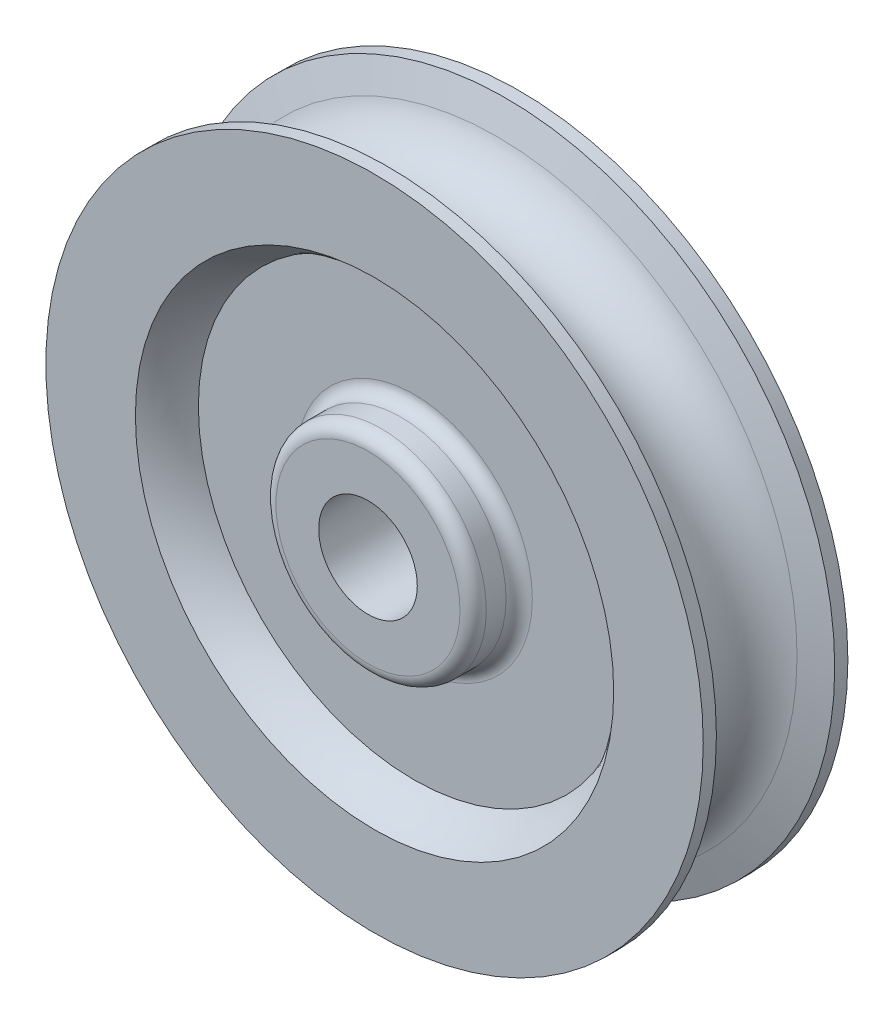
ISO-10303-21;
HEADER;
FILE_DESCRIPTION(('STEP AP214'),'2;1');
FILE_NAME('part.step','',(''),(''),'','','');
FILE_SCHEMA(('AUTOMOTIVE_DESIGN { 1 0 10303 214 1 1 1 1 }'));
ENDSEC;
DATA;
#1=APPLICATION_CONTEXT('core data for automotive mechanical design processes');
#2=APPLICATION_PROTOCOL_DEFINITION('international standard','automotive_design',2000,#1);
#3=PRODUCT_CONTEXT('',#1,'mechanical');
#4=PRODUCT('Part','Part','',(#3));
#5=PRODUCT_RELATED_PRODUCT_CATEGORY('part','',(#4));
#6=PRODUCT_DEFINITION_FORMATION('','',#4);
#7=PRODUCT_DEFINITION_CONTEXT('part definition',#1,'design');
#8=PRODUCT_DEFINITION('design','',#6,#7);
#9=PRODUCT_DEFINITION_SHAPE('','',#8);
#10=(LENGTH_UNIT() NAMED_UNIT(*) SI_UNIT(.MILLI.,.METRE.));
#11=(NAMED_UNIT(*) PLANE_ANGLE_UNIT() SI_UNIT($,.RADIAN.));
#12=(NAMED_UNIT(*) SI_UNIT($,.STERADIAN.) SOLID_ANGLE_UNIT());
#13=UNCERTAINTY_MEASURE_WITH_UNIT(LENGTH_MEASURE(1.E-05),#10,'distance_accuracy_value','');
#14=(GEOMETRIC_REPRESENTATION_CONTEXT(3) GLOBAL_UNCERTAINTY_ASSIGNED_CONTEXT((#13)) GLOBAL_UNIT_ASSIGNED_CONTEXT((#10,
#11,#12)) REPRESENTATION_CONTEXT('',''));
#15=CARTESIAN_POINT('',(0.,0.,0.));
#16=DIRECTION('',(0.,0.,1.));
#17=DIRECTION('',(1.,0.,0.));
#18=AXIS2_PLACEMENT_3D('',#15,#16,#17);
#19=CARTESIAN_POINT('',(0.,0.,-12.));
#20=DIRECTION('',(0.,0.,1.));
#21=DIRECTION('',(1.,0.,0.));
#22=AXIS2_PLACEMENT_3D('',#19,#20,#21);
#23=TOROIDAL_SURFACE('',#22,48.,16.);
#24=CARTESIAN_POINT('',(0.,0.,-23.));
#25=DIRECTION('',(0.,0.,1.));
#26=DIRECTION('',(1.,0.,0.));
#27=AXIS2_PLACEMENT_3D('',#24,#25,#26);
#28=CIRCLE('',#27,36.3810499613777);
#29=CARTESIAN_POINT('',(36.3810499613777,0.,-23.));
#30=VERTEX_POINT('',#29);
#31=EDGE_CURVE('E97',#30,#30,#28,.T.);
#32=ORIENTED_EDGE('',*,*,#31,.F.);
#33=EDGE_LOOP('',(#32));
#34=FACE_BOUND('',#33,.T.);
#35=CARTESIAN_POINT('',(0.,0.,-17.));
#36=DIRECTION('',(0.,0.,1.));
#37=DIRECTION('',(1.,0.,0.));
#38=AXIS2_PLACEMENT_3D('',#35,#36,#37);
#39=CIRCLE('',#38,32.8013158464293);
#40=CARTESIAN_POINT('',(32.8013158464293,0.,-17.));
#41=VERTEX_POINT('',#40);
#42=EDGE_CURVE('E10',#41,#41,#39,.T.);
#43=ORIENTED_EDGE('',*,*,#42,.T.);
#44=EDGE_LOOP('',(#43));
#45=FACE_BOUND('',#44,.T.);
#46=ADVANCED_FACE('F33',(#34,#45),#23,.T.);
#47=CARTESIAN_POINT('',(0.,0.,-17.));
#48=DIRECTION('',(0.,0.,1.));
#49=DIRECTION('',(1.,0.,0.));
#50=AXIS2_PLACEMENT_3D('',#47,#48,#49);
#51=PLANE('',#50);
#52=ORIENTED_EDGE('',*,*,#42,.F.);
#53=EDGE_LOOP('',(#52));
#54=FACE_BOUND('',#53,.T.);
#55=CARTESIAN_POINT('',(0.,0.,-17.));
#56=DIRECTION('',(0.,0.,1.));
#57=DIRECTION('',(1.,0.,0.));
#58=AXIS2_PLACEMENT_3D('',#55,#56,#57);
#59=CIRCLE('',#58,18.);
#60=CARTESIAN_POINT('',(18.,0.,-17.));
#61=VERTEX_POINT('',#60);
#62=EDGE_CURVE('E39',#61,#61,#59,.T.);
#63=ORIENTED_EDGE('',*,*,#62,.T.);
#64=EDGE_LOOP('',(#63));
#65=FACE_BOUND('',#64,.T.);
#66=ADVANCED_FACE('F105',(#54,#65),#51,.F.);
#67=CARTESIAN_POINT('',(0.,0.,-19.));
#68=DIRECTION('',(0.,0.,1.));
#69=DIRECTION('',(1.,0.,0.));
#70=AXIS2_PLACEMENT_3D('',#67,#68,#69);
#71=TOROIDAL_SURFACE('',#70,18.,2.);
#72=ORIENTED_EDGE('',*,*,#62,.F.);
#73=EDGE_LOOP('',(#72));
#74=FACE_BOUND('',#73,.T.);
#75=CARTESIAN_POINT('',(0.,0.,-19.));
#76=DIRECTION('',(0.,0.,1.));
#77=DIRECTION('',(1.,0.,0.));
#78=AXIS2_PLACEMENT_3D('',#75,#76,#77);
#79=CIRCLE('',#78,16.);
#80=CARTESIAN_POINT('',(16.,0.,-19.));
#81=VERTEX_POINT('',#80);
#82=EDGE_CURVE('E43',#81,#81,#79,.T.);
#83=ORIENTED_EDGE('',*,*,#82,.T.);
#84=EDGE_LOOP('',(#83));
#85=FACE_BOUND('',#84,.T.);
#86=ADVANCED_FACE('F109',(#74,#85),#71,.F.);
#87=CARTESIAN_POINT('',(0.,0.,0.));
#88=DIRECTION('',(0.,0.,1.));
#89=DIRECTION('',(1.,0.,0.));
#90=AXIS2_PLACEMENT_3D('',#87,#88,#89);
#91=CYLINDRICAL_SURFACE('',#90,16.);
#92=ORIENTED_EDGE('',*,*,#82,.F.);
#93=EDGE_LOOP('',(#92));
#94=FACE_BOUND('',#93,.T.);
#95=CARTESIAN_POINT('',(0.,0.,-22.));
#96=DIRECTION('',(0.,0.,1.));
#97=DIRECTION('',(1.,0.,0.));
#98=AXIS2_PLACEMENT_3D('',#95,#96,#97);
#99=CIRCLE('',#98,16.);
#100=CARTESIAN_POINT('',(16.,0.,-22.));
#101=VERTEX_POINT('',#100);
#102=EDGE_CURVE('E47',#101,#101,#99,.T.);
#103=ORIENTED_EDGE('',*,*,#102,.T.);
#104=EDGE_LOOP('',(#103));
#105=FACE_BOUND('',#104,.T.);
#106=ADVANCED_FACE('F114',(#94,#105),#91,.T.);
#107=CARTESIAN_POINT('',(0.,0.,-22.));
#108=DIRECTION('',(0.,0.,1.));
#109=DIRECTION('',(1.,0.,0.));
#110=AXIS2_PLACEMENT_3D('',#107,#108,#109);
#111=TOROIDAL_SURFACE('',#110,14.,2.);
#112=ORIENTED_EDGE('',*,*,#102,.F.);
#113=EDGE_LOOP('',(#112));
#114=FACE_BOUND('',#113,.T.);
#115=CARTESIAN_POINT('',(0.,0.,-24.));
#116=DIRECTION('',(0.,0.,1.));
#117=DIRECTION('',(1.,0.,0.));
#118=AXIS2_PLACEMENT_3D('',#115,#116,#117);
#119=CIRCLE('',#118,14.);
#120=CARTESIAN_POINT('',(14.,0.,-24.));
#121=VERTEX_POINT('',#120);
#122=EDGE_CURVE('E52',#121,#121,#119,.T.);
#123=ORIENTED_EDGE('',*,*,#122,.T.);
#124=EDGE_LOOP('',(#123));
#125=FACE_BOUND('',#124,.T.);
#126=ADVANCED_FACE('F120',(#114,#125),#111,.T.);
#127=CARTESIAN_POINT('',(0.,0.,-24.));
#128=DIRECTION('',(0.,0.,1.));
#129=DIRECTION('',(1.,0.,0.));
#130=AXIS2_PLACEMENT_3D('',#127,#128,#129);
#131=PLANE('',#130);
#132=ORIENTED_EDGE('',*,*,#122,.F.);
#133=EDGE_LOOP('',(#132));
#134=FACE_BOUND('',#133,.T.);
#135=CARTESIAN_POINT('',(0.,0.,-24.));
#136=DIRECTION('',(0.,0.,1.));
#137=DIRECTION('',(1.,0.,0.));
#138=AXIS2_PLACEMENT_3D('',#135,#136,#137);
#139=CIRCLE('',#138,7.5);
#140=CARTESIAN_POINT('',(7.5,0.,-24.));
#141=VERTEX_POINT('',#140);
#142=EDGE_CURVE('E55',#141,#141,#139,.T.);
#143=ORIENTED_EDGE('',*,*,#142,.T.);
#144=EDGE_LOOP('',(#143));
#145=FACE_BOUND('',#144,.T.);
#146=ADVANCED_FACE('F124',(#134,#145),#131,.F.);
#147=CARTESIAN_POINT('',(0.,0.,0.));
#148=DIRECTION('',(0.,0.,1.));
#149=DIRECTION('',(1.,0.,0.));
#150=AXIS2_PLACEMENT_3D('',#147,#148,#149);
#151=CYLINDRICAL_SURFACE('',#150,7.5);
#152=CARTESIAN_POINT('',(0.,0.,0.));
#153=DIRECTION('',(0.,0.,1.));
#154=DIRECTION('',(1.,0.,0.));
#155=AXIS2_PLACEMENT_3D('',#152,#153,#154);
#156=CIRCLE('',#155,7.5);
#157=CARTESIAN_POINT('',(7.5,0.,0.));
#158=VERTEX_POINT('',#157);
#159=EDGE_CURVE('E58',#158,#158,#156,.T.);
#160=ORIENTED_EDGE('',*,*,#159,.T.);
#161=EDGE_LOOP('',(#160));
#162=FACE_BOUND('',#161,.T.);
#163=ORIENTED_EDGE('',*,*,#142,.F.);
#164=EDGE_LOOP('',(#163));
#165=FACE_BOUND('',#164,.T.);
#166=ADVANCED_FACE('F128',(#162,#165),#151,.F.);
#167=CARTESIAN_POINT('',(0.,0.,0.));
#168=DIRECTION('',(0.,0.,1.));
#169=DIRECTION('',(1.,0.,0.));
#170=AXIS2_PLACEMENT_3D('',#167,#168,#169);
#171=PLANE('',#170);
#172=CARTESIAN_POINT('',(0.,0.,0.));
#173=DIRECTION('',(0.,0.,1.));
#174=DIRECTION('',(1.,0.,0.));
#175=AXIS2_PLACEMENT_3D('',#172,#173,#174);
#176=CIRCLE('',#175,14.);
#177=CARTESIAN_POINT('',(14.,0.,0.));
#178=VERTEX_POINT('',#177);
#179=EDGE_CURVE('E61',#178,#178,#176,.T.);
#180=ORIENTED_EDGE('',*,*,#179,.T.);
#181=EDGE_LOOP('',(#180));
#182=FACE_BOUND('',#181,.T.);
#183=ORIENTED_EDGE('',*,*,#159,.F.);
#184=EDGE_LOOP('',(#183));
#185=FACE_BOUND('',#184,.T.);
#186=ADVANCED_FACE('F132',(#182,#185),#171,.T.);
#187=CARTESIAN_POINT('',(0.,0.,-2.));
#188=DIRECTION('',(0.,0.,1.));
#189=DIRECTION('',(1.,0.,0.));
#190=AXIS2_PLACEMENT_3D('',#187,#188,#189);
#191=TOROIDAL_SURFACE('',#190,14.,2.);
#192=CARTESIAN_POINT('',(0.,0.,-2.00000000000001));
#193=DIRECTION('',(0.,0.,1.));
#194=DIRECTION('',(1.,0.,0.));
#195=AXIS2_PLACEMENT_3D('',#192,#193,#194);
#196=CIRCLE('',#195,16.);
#197=CARTESIAN_POINT('',(16.,0.,-2.00000000000001));
#198=VERTEX_POINT('',#197);
#199=EDGE_CURVE('E64',#198,#198,#196,.T.);
#200=ORIENTED_EDGE('',*,*,#199,.T.);
#201=EDGE_LOOP('',(#200));
#202=FACE_BOUND('',#201,.T.);
#203=ORIENTED_EDGE('',*,*,#179,.F.);
#204=EDGE_LOOP('',(#203));
#205=FACE_BOUND('',#204,.T.);
#206=ADVANCED_FACE('F136',(#202,#205),#191,.T.);
#207=CARTESIAN_POINT('',(0.,0.,0.));
#208=DIRECTION('',(0.,0.,1.));
#209=DIRECTION('',(1.,0.,0.));
#210=AXIS2_PLACEMENT_3D('',#207,#208,#209);
#211=CYLINDRICAL_SURFACE('',#210,16.);
#212=CARTESIAN_POINT('',(0.,0.,-4.99999999999999));
#213=DIRECTION('',(0.,0.,1.));
#214=DIRECTION('',(1.,0.,0.));
#215=AXIS2_PLACEMENT_3D('',#212,#213,#214);
#216=CIRCLE('',#215,16.);
#217=CARTESIAN_POINT('',(16.,0.,-4.99999999999999));
#218=VERTEX_POINT('',#217);
#219=EDGE_CURVE('E67',#218,#218,#216,.T.);
#220=ORIENTED_EDGE('',*,*,#219,.T.);
#221=EDGE_LOOP('',(#220));
#222=FACE_BOUND('',#221,.T.);
#223=ORIENTED_EDGE('',*,*,#199,.F.);
#224=EDGE_LOOP('',(#223));
#225=FACE_BOUND('',#224,.T.);
#226=ADVANCED_FACE('F140',(#222,#225),#211,.T.);
#227=CARTESIAN_POINT('',(0.,0.,-5.));
#228=DIRECTION('',(0.,0.,1.));
#229=DIRECTION('',(1.,0.,0.));
#230=AXIS2_PLACEMENT_3D('',#227,#228,#229);
#231=TOROIDAL_SURFACE('',#230,18.,2.);
#232=CARTESIAN_POINT('',(0.,0.,-7.));
#233=DIRECTION('',(0.,0.,1.));
#234=DIRECTION('',(1.,0.,0.));
#235=AXIS2_PLACEMENT_3D('',#232,#233,#234);
#236=CIRCLE('',#235,18.);
#237=CARTESIAN_POINT('',(18.,0.,-7.));
#238=VERTEX_POINT('',#237);
#239=EDGE_CURVE('E70',#238,#238,#236,.T.);
#240=ORIENTED_EDGE('',*,*,#239,.T.);
#241=EDGE_LOOP('',(#240));
#242=FACE_BOUND('',#241,.T.);
#243=ORIENTED_EDGE('',*,*,#219,.F.);
#244=EDGE_LOOP('',(#243));
#245=FACE_BOUND('',#244,.T.);
#246=ADVANCED_FACE('F144',(#242,#245),#231,.F.);
#247=CARTESIAN_POINT('',(0.,0.,-7.));
#248=DIRECTION('',(0.,0.,1.));
#249=DIRECTION('',(1.,0.,0.));
#250=AXIS2_PLACEMENT_3D('',#247,#248,#249);
#251=PLANE('',#250);
#252=CARTESIAN_POINT('',(0.,0.,-7.));
#253=DIRECTION('',(0.,0.,1.));
#254=DIRECTION('',(1.,0.,0.));
#255=AXIS2_PLACEMENT_3D('',#252,#253,#254);
#256=CIRCLE('',#255,32.8013158464293);
#257=CARTESIAN_POINT('',(32.8013158464293,0.,-7.));
#258=VERTEX_POINT('',#257);
#259=EDGE_CURVE('E73',#258,#258,#256,.T.);
#260=ORIENTED_EDGE('',*,*,#259,.T.);
#261=EDGE_LOOP('',(#260));
#262=FACE_BOUND('',#261,.T.);
#263=ORIENTED_EDGE('',*,*,#239,.F.);
#264=EDGE_LOOP('',(#263));
#265=FACE_BOUND('',#264,.T.);
#266=ADVANCED_FACE('F148',(#262,#265),#251,.T.);
#267=CARTESIAN_POINT('',(0.,0.,-12.));
#268=DIRECTION('',(0.,0.,1.));
#269=DIRECTION('',(1.,0.,0.));
#270=AXIS2_PLACEMENT_3D('',#267,#268,#269);
#271=TOROIDAL_SURFACE('',#270,48.,16.);
#272=CARTESIAN_POINT('',(0.,0.,-1.));
#273=DIRECTION('',(0.,0.,1.));
#274=DIRECTION('',(1.,0.,0.));
#275=AXIS2_PLACEMENT_3D('',#272,#273,#274);
#276=CIRCLE('',#275,36.3810499613777);
#277=CARTESIAN_POINT('',(36.3810499613777,0.,-1.));
#278=VERTEX_POINT('',#277);
#279=EDGE_CURVE('E76',#278,#278,#276,.T.);
#280=ORIENTED_EDGE('',*,*,#279,.T.);
#281=EDGE_LOOP('',(#280));
#282=FACE_BOUND('',#281,.T.);
#283=ORIENTED_EDGE('',*,*,#259,.F.);
#284=EDGE_LOOP('',(#283));
#285=FACE_BOUND('',#284,.T.);
#286=ADVANCED_FACE('F152',(#282,#285),#271,.T.);
#287=CARTESIAN_POINT('',(0.,0.,-1.));
#288=DIRECTION('',(0.,0.,-1.));
#289=DIRECTION('',(-1.,0.,0.));
#290=AXIS2_PLACEMENT_3D('',#287,#288,#289);
#291=PLANE('',#290);
#292=ORIENTED_EDGE('',*,*,#279,.F.);
#293=EDGE_LOOP('',(#292));
#294=FACE_BOUND('',#293,.T.);
#295=CARTESIAN_POINT('',(0.,0.,-1.));
#296=DIRECTION('',(0.,0.,1.));
#297=DIRECTION('',(1.,0.,0.));
#298=AXIS2_PLACEMENT_3D('',#295,#296,#297);
#299=CIRCLE('',#298,49.9999892891338);
#300=CARTESIAN_POINT('',(49.9999892891338,0.,-1.));
#301=VERTEX_POINT('',#300);
#302=EDGE_CURVE('E79',#301,#301,#299,.T.);
#303=ORIENTED_EDGE('',*,*,#302,.T.);
#304=EDGE_LOOP('',(#303));
#305=FACE_BOUND('',#304,.T.);
#306=ADVANCED_FACE('F156',(#294,#305),#291,.F.);
#307=CARTESIAN_POINT('',(0.,0.,0.));
#308=DIRECTION('',(0.,0.,1.));
#309=DIRECTION('',(1.,0.,0.));
#310=AXIS2_PLACEMENT_3D('',#307,#308,#309);
#311=CYLINDRICAL_SURFACE('',#310,49.9999892891338);
#312=ORIENTED_EDGE('',*,*,#302,.F.);
#313=EDGE_LOOP('',(#312));
#314=FACE_BOUND('',#313,.T.);
#315=CARTESIAN_POINT('',(0.,0.,-2.99996556198922));
#316=DIRECTION('',(0.,0.,1.));
#317=DIRECTION('',(1.,0.,0.));
#318=AXIS2_PLACEMENT_3D('',#315,#316,#317);
#319=CIRCLE('',#318,49.9999892891338);
#320=CARTESIAN_POINT('',(49.9999892891338,0.,-2.99996556198922));
#321=VERTEX_POINT('',#320);
#322=EDGE_CURVE('E82',#321,#321,#319,.T.);
#323=ORIENTED_EDGE('',*,*,#322,.T.);
#324=EDGE_LOOP('',(#323));
#325=FACE_BOUND('',#324,.T.);
#326=ADVANCED_FACE('F160',(#314,#325),#311,.T.);
#327=CARTESIAN_POINT('',(0.,0.,-2.99996556198922));
#328=DIRECTION('',(0.,0.,1.));
#329=DIRECTION('',(1.,0.,0.));
#330=AXIS2_PLACEMENT_3D('',#327,#328,#329);
#331=CONICAL_SURFACE('',#330,49.9999892891338,1.26926151686799);
#332=CARTESIAN_POINT('',(0.,0.,-4.36094562606424));
#333=DIRECTION('',(0.,0.,1.));
#334=DIRECTION('',(1.,0.,0.));
#335=AXIS2_PLACEMENT_3D('',#332,#333,#334);
#336=CIRCLE('',#335,45.6241110564564);
#337=CARTESIAN_POINT('',(45.6241110564564,0.,-4.36094562606424));
#338=VERTEX_POINT('',#337);
#339=EDGE_CURVE('E85',#338,#338,#336,.T.);
#340=ORIENTED_EDGE('',*,*,#339,.T.);
#341=EDGE_LOOP('',(#340));
#342=FACE_BOUND('',#341,.T.);
#343=ORIENTED_EDGE('',*,*,#322,.F.);
#344=EDGE_LOOP('',(#343));
#345=FACE_BOUND('',#344,.T.);
#346=ADVANCED_FACE('F164',(#342,#345),#331,.T.);
#347=CARTESIAN_POINT('',(0.,0.,-12.));
#348=DIRECTION('',(0.,0.,1.));
#349=DIRECTION('',(1.,0.,0.));
#350=AXIS2_PLACEMENT_3D('',#347,#348,#349);
#351=TOROIDAL_SURFACE('',#350,48.,8.);
#352=ORIENTED_EDGE('',*,*,#339,.F.);
#353=EDGE_LOOP('',(#352));
#354=FACE_BOUND('',#353,.T.);
#355=CARTESIAN_POINT('',(0.,0.,-19.6390543739358));
#356=DIRECTION('',(0.,0.,1.));
#357=DIRECTION('',(1.,0.,0.));
#358=AXIS2_PLACEMENT_3D('',#355,#356,#357);
#359=CIRCLE('',#358,45.6241110564564);
#360=CARTESIAN_POINT('',(45.6241110564564,0.,-19.6390543739358));
#361=VERTEX_POINT('',#360);
#362=EDGE_CURVE('E88',#361,#361,#359,.T.);
#363=ORIENTED_EDGE('',*,*,#362,.T.);
#364=EDGE_LOOP('',(#363));
#365=FACE_BOUND('',#364,.T.);
#366=ADVANCED_FACE('F168',(#354,#365),#351,.F.);
#367=CARTESIAN_POINT('',(0.,0.,-21.0000344380108));
#368=DIRECTION('',(0.,0.,-1.));
#369=DIRECTION('',(-1.,0.,0.));
#370=AXIS2_PLACEMENT_3D('',#367,#368,#369);
#371=CONICAL_SURFACE('',#370,49.9999892891338,1.26926151686799);
#372=ORIENTED_EDGE('',*,*,#362,.F.);
#373=EDGE_LOOP('',(#372));
#374=FACE_BOUND('',#373,.T.);
#375=CARTESIAN_POINT('',(0.,0.,-21.0000344380108));
#376=DIRECTION('',(0.,0.,1.));
#377=DIRECTION('',(1.,0.,0.));
#378=AXIS2_PLACEMENT_3D('',#375,#376,#377);
#379=CIRCLE('',#378,49.9999892891338);
#380=CARTESIAN_POINT('',(49.9999892891338,0.,-21.0000344380108));
#381=VERTEX_POINT('',#380);
#382=EDGE_CURVE('E91',#381,#381,#379,.T.);
#383=ORIENTED_EDGE('',*,*,#382,.T.);
#384=EDGE_LOOP('',(#383));
#385=FACE_BOUND('',#384,.T.);
#386=ADVANCED_FACE('F172',(#374,#385),#371,.T.);
#387=CARTESIAN_POINT('',(0.,0.,0.));
#388=DIRECTION('',(0.,0.,1.));
#389=DIRECTION('',(1.,0.,0.));
#390=AXIS2_PLACEMENT_3D('',#387,#388,#389);
#391=CYLINDRICAL_SURFACE('',#390,49.9999892891338);
#392=CARTESIAN_POINT('',(0.,0.,-23.));
#393=DIRECTION('',(0.,0.,1.));
#394=DIRECTION('',(1.,0.,0.));
#395=AXIS2_PLACEMENT_3D('',#392,#393,#394);
#396=CIRCLE('',#395,49.9999892891338);
#397=CARTESIAN_POINT('',(49.9999892891338,0.,-23.));
#398=VERTEX_POINT('',#397);
#399=EDGE_CURVE('E94',#398,#398,#396,.T.);
#400=ORIENTED_EDGE('',*,*,#399,.T.);
#401=EDGE_LOOP('',(#400));
#402=FACE_BOUND('',#401,.T.);
#403=ORIENTED_EDGE('',*,*,#382,.F.);
#404=EDGE_LOOP('',(#403));
#405=FACE_BOUND('',#404,.T.);
#406=ADVANCED_FACE('F176',(#402,#405),#391,.T.);
#407=CARTESIAN_POINT('',(0.,0.,-23.));
#408=DIRECTION('',(0.,0.,-1.));
#409=DIRECTION('',(-1.,0.,0.));
#410=AXIS2_PLACEMENT_3D('',#407,#408,#409);
#411=PLANE('',#410);
#412=ORIENTED_EDGE('',*,*,#31,.T.);
#413=EDGE_LOOP('',(#412));
#414=FACE_BOUND('',#413,.T.);
#415=ORIENTED_EDGE('',*,*,#399,.F.);
#416=EDGE_LOOP('',(#415));
#417=FACE_BOUND('',#416,.T.);
#418=ADVANCED_FACE('F101',(#414,#417),#411,.T.);
#419=CLOSED_SHELL('',(#46,#66,#86,#106,#126,#146,#166,#186,#206,#226,#246,#266,#286,#306,#326,
#346,#366,#386,#406,#418));
#420=MANIFOLD_SOLID_BREP('B2',#419);
#421=ADVANCED_BREP_SHAPE_REPRESENTATION('',(#18,#420),#14);
#422=SHAPE_DEFINITION_REPRESENTATION(#9,#421);
ENDSEC;
END-ISO-10303-21;
